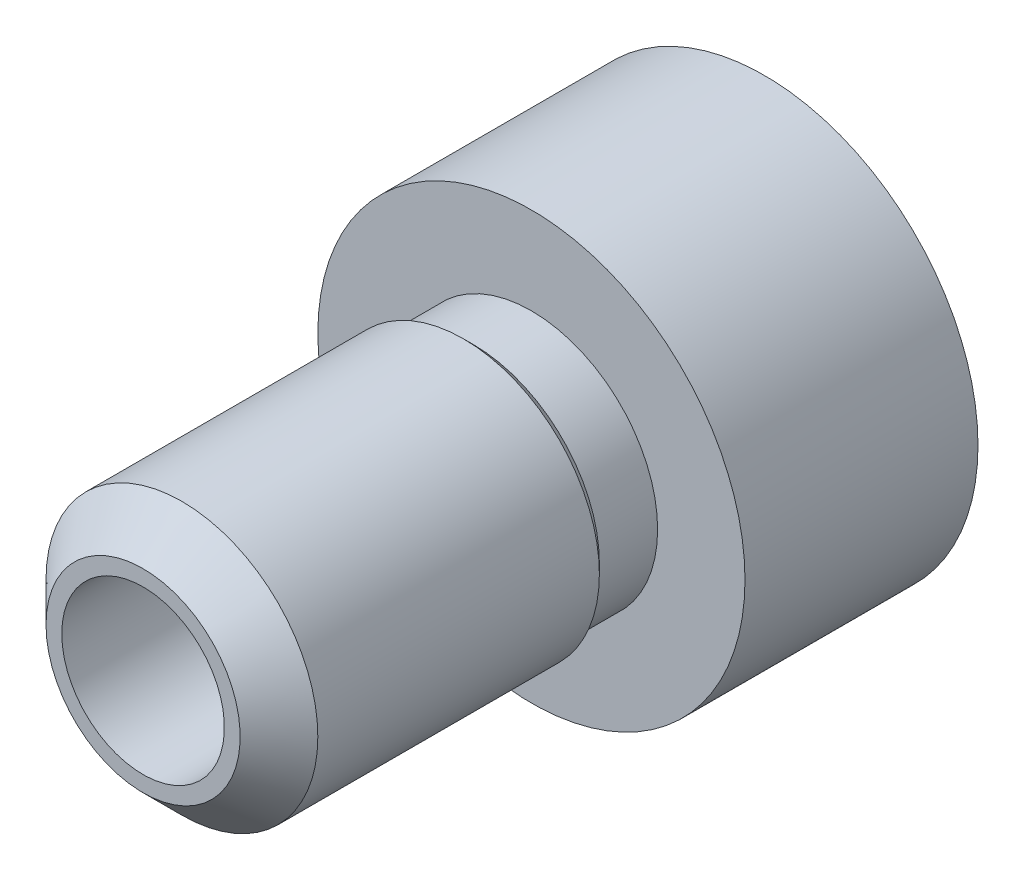
ISO-10303-21;
HEADER;
FILE_DESCRIPTION(('STEP AP214'),'2;1');
FILE_NAME('part.step','',(''),(''),'','','');
FILE_SCHEMA(('AUTOMOTIVE_DESIGN { 1 0 10303 214 1 1 1 1 }'));
ENDSEC;
DATA;
#1=APPLICATION_CONTEXT('core data for automotive mechanical design processes');
#2=APPLICATION_PROTOCOL_DEFINITION('international standard','automotive_design',2000,#1);
#3=PRODUCT_CONTEXT('',#1,'mechanical');
#4=PRODUCT('Part','Part','',(#3));
#5=PRODUCT_RELATED_PRODUCT_CATEGORY('part','',(#4));
#6=PRODUCT_DEFINITION_FORMATION('','',#4);
#7=PRODUCT_DEFINITION_CONTEXT('part definition',#1,'design');
#8=PRODUCT_DEFINITION('design','',#6,#7);
#9=PRODUCT_DEFINITION_SHAPE('','',#8);
#10=(LENGTH_UNIT() NAMED_UNIT(*) SI_UNIT(.MILLI.,.METRE.));
#11=(NAMED_UNIT(*) PLANE_ANGLE_UNIT() SI_UNIT($,.RADIAN.));
#12=(NAMED_UNIT(*) SI_UNIT($,.STERADIAN.) SOLID_ANGLE_UNIT());
#13=UNCERTAINTY_MEASURE_WITH_UNIT(LENGTH_MEASURE(1.E-05),#10,'distance_accuracy_value','');
#14=(GEOMETRIC_REPRESENTATION_CONTEXT(3) GLOBAL_UNCERTAINTY_ASSIGNED_CONTEXT((#13)) GLOBAL_UNIT_ASSIGNED_CONTEXT((#10,
#11,#12)) REPRESENTATION_CONTEXT('',''));
#15=CARTESIAN_POINT('',(0.,0.,0.));
#16=DIRECTION('',(0.,0.,1.));
#17=DIRECTION('',(1.,0.,0.));
#18=AXIS2_PLACEMENT_3D('',#15,#16,#17);
#19=CARTESIAN_POINT('',(-12.3923443129473,9.13875585771456,29.9999999999727));
#20=DIRECTION('',(0.,0.,-1.));
#21=DIRECTION('',(-1.,0.,0.));
#22=AXIS2_PLACEMENT_3D('',#19,#20,#21);
#23=CONICAL_SURFACE('',#22,6.99999999995785,0.785398163397448);
#24=CARTESIAN_POINT('',(-12.3923443129473,9.13875585771456,30.));
#25=DIRECTION('',(0.,0.,1.));
#26=DIRECTION('',(1.,0.,0.));
#27=AXIS2_PLACEMENT_3D('',#24,#25,#26);
#28=CIRCLE('',#27,7.);
#29=CARTESIAN_POINT('',(-5.3923443129473,9.13875585771456,30.));
#30=VERTEX_POINT('',#29);
#31=EDGE_CURVE('E50',#30,#30,#28,.F.);
#32=ORIENTED_EDGE('',*,*,#31,.F.);
#33=EDGE_LOOP('',(#32));
#34=FACE_BOUND('',#33,.T.);
#35=CARTESIAN_POINT('',(-12.3923443129473,9.13875585771456,31.9999999999254));
#36=DIRECTION('',(0.,0.,-1.));
#37=DIRECTION('',(-1.,0.,0.));
#38=AXIS2_PLACEMENT_3D('',#35,#36,#37);
#39=CIRCLE('',#38,5.00000000000515);
#40=CARTESIAN_POINT('',(-17.3923443129524,9.13875585771456,31.9999999999254));
#41=VERTEX_POINT('',#40);
#42=EDGE_CURVE('E17',#41,#41,#39,.T.);
#43=ORIENTED_EDGE('',*,*,#42,.T.);
#44=EDGE_LOOP('',(#43));
#45=FACE_BOUND('',#44,.T.);
#46=ADVANCED_FACE('F14',(#34,#45),#23,.T.);
#47=CARTESIAN_POINT('',(-12.3923443129473,9.13875585771456,12.));
#48=DIRECTION('',(0.,0.,1.));
#49=DIRECTION('',(1.,0.,0.));
#50=AXIS2_PLACEMENT_3D('',#47,#48,#49);
#51=CYLINDRICAL_SURFACE('',#50,7.);
#52=CARTESIAN_POINT('',(-12.3923443129473,9.13875585771456,15.4999999999745));
#53=DIRECTION('',(0.,0.,1.));
#54=DIRECTION('',(-1.,0.,0.));
#55=AXIS2_PLACEMENT_3D('',#52,#53,#54);
#56=CIRCLE('',#55,7.0000000000147);
#57=CARTESIAN_POINT('',(-19.392344312962,9.13875585771456,15.4999999999745));
#58=VERTEX_POINT('',#57);
#59=EDGE_CURVE('E40',#58,#58,#56,.F.);
#60=ORIENTED_EDGE('',*,*,#59,.F.);
#61=EDGE_LOOP('',(#60));
#62=FACE_BOUND('',#61,.T.);
#63=ORIENTED_EDGE('',*,*,#31,.T.);
#64=EDGE_LOOP('',(#63));
#65=FACE_BOUND('',#64,.T.);
#66=ADVANCED_FACE('F58',(#62,#65),#51,.T.);
#67=CARTESIAN_POINT('',(-12.3923443129473,9.13875585771456,32.));
#68=DIRECTION('',(0.,0.,-1.));
#69=DIRECTION('',(-1.,0.,0.));
#70=AXIS2_PLACEMENT_3D('',#67,#68,#69);
#71=PLANE('',#70);
#72=CARTESIAN_POINT('',(-12.3923443129473,9.13875585771456,32.));
#73=DIRECTION('',(0.,0.,-1.));
#74=DIRECTION('',(-1.,0.,0.));
#75=AXIS2_PLACEMENT_3D('',#72,#73,#74);
#76=CIRCLE('',#75,4.188);
#77=CARTESIAN_POINT('',(-16.5803443129473,9.13875585771456,32.));
#78=VERTEX_POINT('',#77);
#79=EDGE_CURVE('E37',#78,#78,#76,.T.);
#80=ORIENTED_EDGE('',*,*,#79,.T.);
#81=EDGE_LOOP('',(#80));
#82=FACE_BOUND('',#81,.T.);
#83=ORIENTED_EDGE('',*,*,#42,.F.);
#84=EDGE_LOOP('',(#83));
#85=FACE_BOUND('',#84,.T.);
#86=ADVANCED_FACE('F64',(#82,#85),#71,.F.);
#87=CARTESIAN_POINT('',(-12.3923443129473,9.13875585771456,15.4999999999177));
#88=DIRECTION('',(0.,0.,1.));
#89=DIRECTION('',(1.,0.,0.));
#90=AXIS2_PLACEMENT_3D('',#87,#88,#89);
#91=CONICAL_SURFACE('',#90,6.99999999990101,0.785398163397448);
#92=ORIENTED_EDGE('',*,*,#59,.T.);
#93=EDGE_LOOP('',(#92));
#94=FACE_BOUND('',#93,.T.);
#95=CARTESIAN_POINT('',(-12.3923443129473,9.13875585771456,15.));
#96=DIRECTION('',(0.,0.,1.));
#97=DIRECTION('',(1.,0.,0.));
#98=AXIS2_PLACEMENT_3D('',#95,#96,#97);
#99=CIRCLE('',#98,6.5);
#100=CARTESIAN_POINT('',(-5.8923443129473,9.13875585771456,15.));
#101=VERTEX_POINT('',#100);
#102=EDGE_CURVE('E39',#101,#101,#99,.F.);
#103=ORIENTED_EDGE('',*,*,#102,.F.);
#104=EDGE_LOOP('',(#103));
#105=FACE_BOUND('',#104,.T.);
#106=ADVANCED_FACE('F66',(#94,#105),#91,.T.);
#107=CARTESIAN_POINT('',(-12.3923443129473,9.13875585771456,44.6318272088428));
#108=DIRECTION('',(0.,0.,-1.));
#109=DIRECTION('',(-1.,0.,0.));
#110=AXIS2_PLACEMENT_3D('',#107,#108,#109);
#111=CYLINDRICAL_SURFACE('',#110,4.188);
#112=CARTESIAN_POINT('',(-12.3923443129473,9.13875585771456,0.934099146661538));
#113=DIRECTION('',(0.,0.,-1.));
#114=DIRECTION('',(-1.,0.,0.));
#115=AXIS2_PLACEMENT_3D('',#112,#113,#114);
#116=CIRCLE('',#115,4.18800000000889);
#117=CARTESIAN_POINT('',(-16.5803443129562,9.13875585771456,0.934099146661538));
#118=VERTEX_POINT('',#117);
#119=EDGE_CURVE('E36',#118,#118,#116,.T.);
#120=ORIENTED_EDGE('',*,*,#119,.T.);
#121=EDGE_LOOP('',(#120));
#122=FACE_BOUND('',#121,.T.);
#123=ORIENTED_EDGE('',*,*,#79,.F.);
#124=EDGE_LOOP('',(#123));
#125=FACE_BOUND('',#124,.T.);
#126=ADVANCED_FACE('F73',(#122,#125),#111,.F.);
#127=CARTESIAN_POINT('',(-12.3923443129473,9.13875585771456,12.));
#128=DIRECTION('',(0.,0.,1.));
#129=DIRECTION('',(1.,0.,0.));
#130=AXIS2_PLACEMENT_3D('',#127,#128,#129);
#131=CYLINDRICAL_SURFACE('',#130,6.5);
#132=CARTESIAN_POINT('',(-12.3923443129473,9.13875585771456,12.));
#133=DIRECTION('',(0.,0.,1.));
#134=DIRECTION('',(1.,0.,0.));
#135=AXIS2_PLACEMENT_3D('',#132,#133,#134);
#136=CIRCLE('',#135,6.5);
#137=CARTESIAN_POINT('',(-5.8923443129473,9.13875585771456,12.));
#138=VERTEX_POINT('',#137);
#139=EDGE_CURVE('E34',#138,#138,#136,.T.);
#140=ORIENTED_EDGE('',*,*,#139,.T.);
#141=EDGE_LOOP('',(#140));
#142=FACE_BOUND('',#141,.T.);
#143=ORIENTED_EDGE('',*,*,#102,.T.);
#144=EDGE_LOOP('',(#143));
#145=FACE_BOUND('',#144,.T.);
#146=ADVANCED_FACE('F94',(#142,#145),#131,.T.);
#147=CARTESIAN_POINT('',(-12.3923443129473,9.13875585771456,0.));
#148=DIRECTION('',(0.,0.,-1.));
#149=DIRECTION('',(-1.,0.,0.));
#150=AXIS2_PLACEMENT_3D('',#147,#148,#149);
#151=CONICAL_SURFACE('',#150,5.00000000000515,0.715584993316414);
#152=ORIENTED_EDGE('',*,*,#119,.F.);
#153=EDGE_LOOP('',(#152));
#154=FACE_BOUND('',#153,.T.);
#155=CARTESIAN_POINT('',(-12.3923443129473,9.13875585771456,0.));
#156=DIRECTION('',(0.,0.,-1.));
#157=DIRECTION('',(-1.,0.,0.));
#158=AXIS2_PLACEMENT_3D('',#155,#156,#157);
#159=CIRCLE('',#158,5.00000000000515);
#160=CARTESIAN_POINT('',(-17.3923443129524,9.13875585771456,0.));
#161=VERTEX_POINT('',#160);
#162=EDGE_CURVE('E26',#161,#161,#159,.F.);
#163=ORIENTED_EDGE('',*,*,#162,.F.);
#164=EDGE_LOOP('',(#163));
#165=FACE_BOUND('',#164,.T.);
#166=ADVANCED_FACE('F90',(#154,#165),#151,.F.);
#167=CARTESIAN_POINT('',(-12.3923443129473,9.13875585771456,12.));
#168=DIRECTION('',(0.,0.,-1.));
#169=DIRECTION('',(-1.,0.,0.));
#170=AXIS2_PLACEMENT_3D('',#167,#168,#169);
#171=PLANE('',#170);
#172=ORIENTED_EDGE('',*,*,#139,.F.);
#173=EDGE_LOOP('',(#172));
#174=FACE_BOUND('',#173,.T.);
#175=CARTESIAN_POINT('',(-12.3923443129473,9.13875585771456,12.));
#176=DIRECTION('',(0.,0.,1.));
#177=DIRECTION('',(1.,0.,0.));
#178=AXIS2_PLACEMENT_3D('',#175,#176,#177);
#179=CIRCLE('',#178,11.);
#180=CARTESIAN_POINT('',(-1.3923443129473,9.13875585771456,12.));
#181=VERTEX_POINT('',#180);
#182=EDGE_CURVE('E21',#181,#181,#179,.F.);
#183=ORIENTED_EDGE('',*,*,#182,.F.);
#184=EDGE_LOOP('',(#183));
#185=FACE_BOUND('',#184,.T.);
#186=ADVANCED_FACE('F83',(#174,#185),#171,.F.);
#187=CARTESIAN_POINT('',(-12.3923443129473,9.13875585771456,0.));
#188=DIRECTION('',(0.,0.,-1.));
#189=DIRECTION('',(-1.,0.,0.));
#190=AXIS2_PLACEMENT_3D('',#187,#188,#189);
#191=PLANE('',#190);
#192=ORIENTED_EDGE('',*,*,#162,.T.);
#193=EDGE_LOOP('',(#192));
#194=FACE_BOUND('',#193,.T.);
#195=CARTESIAN_POINT('',(-12.3923443129473,9.13875585771456,0.));
#196=DIRECTION('',(0.,0.,1.));
#197=DIRECTION('',(1.,0.,0.));
#198=AXIS2_PLACEMENT_3D('',#195,#196,#197);
#199=CIRCLE('',#198,11.);
#200=CARTESIAN_POINT('',(-1.3923443129473,9.13875585771456,0.));
#201=VERTEX_POINT('',#200);
#202=EDGE_CURVE('E10',#201,#201,#199,.T.);
#203=ORIENTED_EDGE('',*,*,#202,.F.);
#204=EDGE_LOOP('',(#203));
#205=FACE_BOUND('',#204,.T.);
#206=ADVANCED_FACE('F78',(#194,#205),#191,.T.);
#207=CARTESIAN_POINT('',(-12.3923443129473,9.13875585771456,0.));
#208=DIRECTION('',(0.,0.,1.));
#209=DIRECTION('',(1.,0.,0.));
#210=AXIS2_PLACEMENT_3D('',#207,#208,#209);
#211=CYLINDRICAL_SURFACE('',#210,11.);
#212=ORIENTED_EDGE('',*,*,#202,.T.);
#213=EDGE_LOOP('',(#212));
#214=FACE_BOUND('',#213,.T.);
#215=ORIENTED_EDGE('',*,*,#182,.T.);
#216=EDGE_LOOP('',(#215));
#217=FACE_BOUND('',#216,.T.);
#218=ADVANCED_FACE('F76',(#214,#217),#211,.T.);
#219=CLOSED_SHELL('',(#46,#66,#86,#106,#126,#146,#166,#186,#206,#218));
#220=MANIFOLD_SOLID_BREP('B1',#219);
#221=ADVANCED_BREP_SHAPE_REPRESENTATION('',(#18,#220),#14);
#222=SHAPE_DEFINITION_REPRESENTATION(#9,#221);
ENDSEC;
END-ISO-10303-21;
